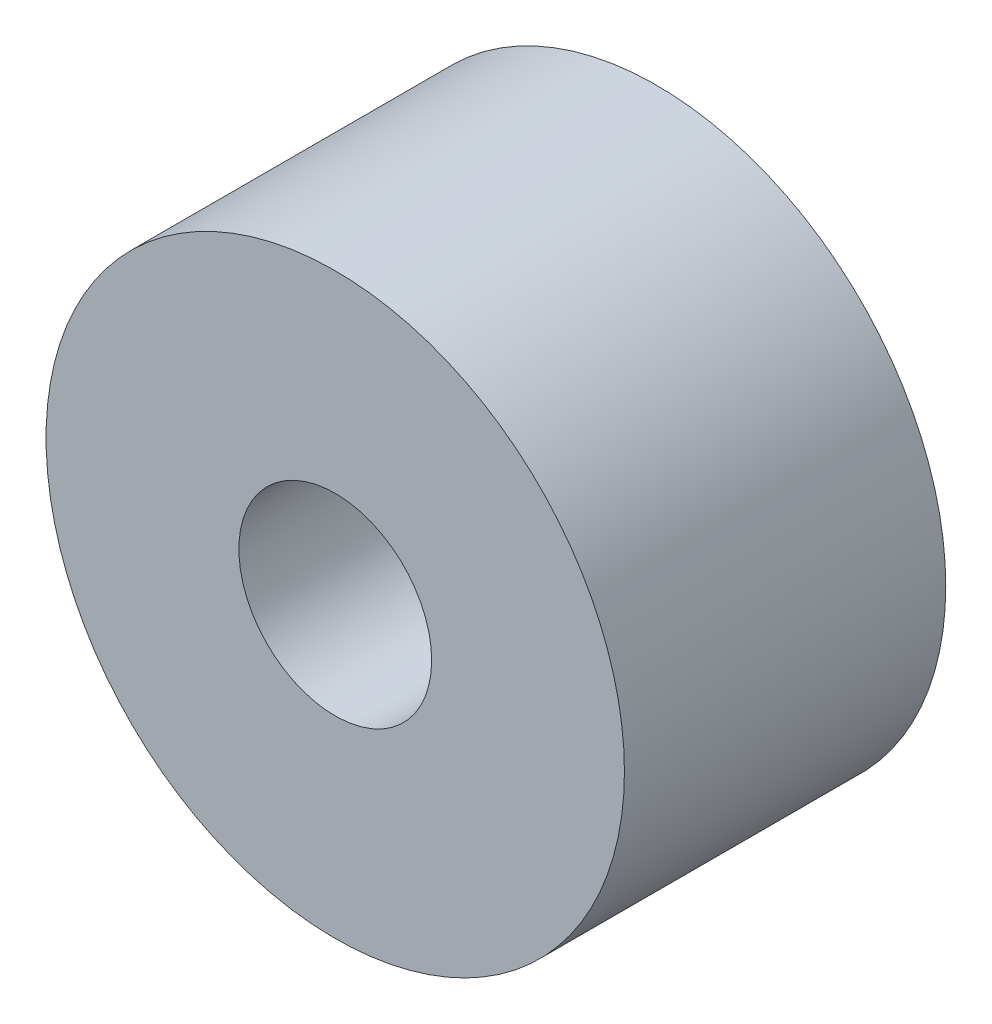
ISO-10303-21;
HEADER;
FILE_DESCRIPTION(('STEP AP214'),'2;1');
FILE_NAME('part.step','',(''),(''),'','','');
FILE_SCHEMA(('AUTOMOTIVE_DESIGN { 1 0 10303 214 1 1 1 1 }'));
ENDSEC;
DATA;
#1=APPLICATION_CONTEXT('core data for automotive mechanical design processes');
#2=APPLICATION_PROTOCOL_DEFINITION('international standard','automotive_design',2000,#1);
#3=PRODUCT_CONTEXT('',#1,'mechanical');
#4=PRODUCT('Part','Part','',(#3));
#5=PRODUCT_RELATED_PRODUCT_CATEGORY('part','',(#4));
#6=PRODUCT_DEFINITION_FORMATION('','',#4);
#7=PRODUCT_DEFINITION_CONTEXT('part definition',#1,'design');
#8=PRODUCT_DEFINITION('design','',#6,#7);
#9=PRODUCT_DEFINITION_SHAPE('','',#8);
#10=(LENGTH_UNIT() NAMED_UNIT(*) SI_UNIT(.MILLI.,.METRE.));
#11=(NAMED_UNIT(*) PLANE_ANGLE_UNIT() SI_UNIT($,.RADIAN.));
#12=(NAMED_UNIT(*) SI_UNIT($,.STERADIAN.) SOLID_ANGLE_UNIT());
#13=UNCERTAINTY_MEASURE_WITH_UNIT(LENGTH_MEASURE(1.E-05),#10,'distance_accuracy_value','');
#14=(GEOMETRIC_REPRESENTATION_CONTEXT(3) GLOBAL_UNCERTAINTY_ASSIGNED_CONTEXT((#13)) GLOBAL_UNIT_ASSIGNED_CONTEXT((#10,
#11,#12)) REPRESENTATION_CONTEXT('',''));
#15=CARTESIAN_POINT('',(0.,0.,0.));
#16=DIRECTION('',(0.,0.,1.));
#17=DIRECTION('',(1.,0.,0.));
#18=AXIS2_PLACEMENT_3D('',#15,#16,#17);
#19=CARTESIAN_POINT('',(0.,0.,5.));
#20=DIRECTION('',(0.,0.,1.));
#21=DIRECTION('',(1.,0.,0.));
#22=AXIS2_PLACEMENT_3D('',#19,#20,#21);
#23=PLANE('',#22);
#24=CARTESIAN_POINT('',(0.,0.,5.));
#25=DIRECTION('',(0.,0.,1.));
#26=DIRECTION('',(1.,0.,0.));
#27=AXIS2_PLACEMENT_3D('',#24,#25,#26);
#28=CIRCLE('',#27,4.5);
#29=CARTESIAN_POINT('',(4.5,0.,5.));
#30=VERTEX_POINT('',#29);
#31=EDGE_CURVE('E10',#30,#30,#28,.T.);
#32=ORIENTED_EDGE('',*,*,#31,.T.);
#33=EDGE_LOOP('',(#32));
#34=FACE_BOUND('',#33,.T.);
#35=CARTESIAN_POINT('',(0.,0.,5.));
#36=DIRECTION('',(0.,0.,1.));
#37=DIRECTION('',(1.,0.,0.));
#38=AXIS2_PLACEMENT_3D('',#35,#36,#37);
#39=CIRCLE('',#38,1.5);
#40=CARTESIAN_POINT('',(1.5,0.,5.));
#41=VERTEX_POINT('',#40);
#42=EDGE_CURVE('E48',#41,#41,#39,.T.);
#43=ORIENTED_EDGE('',*,*,#42,.F.);
#44=EDGE_LOOP('',(#43));
#45=FACE_BOUND('',#44,.T.);
#46=ADVANCED_FACE('F37',(#34,#45),#23,.T.);
#47=CARTESIAN_POINT('',(0.,0.,0.));
#48=DIRECTION('',(0.,0.,1.));
#49=DIRECTION('',(1.,0.,0.));
#50=AXIS2_PLACEMENT_3D('',#47,#48,#49);
#51=PLANE('',#50);
#52=CARTESIAN_POINT('',(0.,0.,0.));
#53=DIRECTION('',(0.,0.,1.));
#54=DIRECTION('',(1.,0.,0.));
#55=AXIS2_PLACEMENT_3D('',#52,#53,#54);
#56=CIRCLE('',#55,4.5);
#57=CARTESIAN_POINT('',(4.5,0.,0.));
#58=VERTEX_POINT('',#57);
#59=EDGE_CURVE('E41',#58,#58,#56,.T.);
#60=ORIENTED_EDGE('',*,*,#59,.F.);
#61=EDGE_LOOP('',(#60));
#62=FACE_BOUND('',#61,.T.);
#63=CARTESIAN_POINT('',(0.,0.,0.));
#64=DIRECTION('',(0.,0.,1.));
#65=DIRECTION('',(1.,0.,0.));
#66=AXIS2_PLACEMENT_3D('',#63,#64,#65);
#67=CIRCLE('',#66,1.5);
#68=CARTESIAN_POINT('',(1.5,0.,0.));
#69=VERTEX_POINT('',#68);
#70=EDGE_CURVE('E50',#69,#69,#67,.T.);
#71=ORIENTED_EDGE('',*,*,#70,.T.);
#72=EDGE_LOOP('',(#71));
#73=FACE_BOUND('',#72,.T.);
#74=ADVANCED_FACE('F60',(#62,#73),#51,.F.);
#75=CARTESIAN_POINT('',(0.,0.,5.));
#76=DIRECTION('',(0.,0.,-1.));
#77=DIRECTION('',(-1.,0.,0.));
#78=AXIS2_PLACEMENT_3D('',#75,#76,#77);
#79=CYLINDRICAL_SURFACE('',#78,4.5);
#80=ORIENTED_EDGE('',*,*,#31,.F.);
#81=EDGE_LOOP('',(#80));
#82=FACE_BOUND('',#81,.T.);
#83=ORIENTED_EDGE('',*,*,#59,.T.);
#84=EDGE_LOOP('',(#83));
#85=FACE_BOUND('',#84,.T.);
#86=ADVANCED_FACE('F39',(#82,#85),#79,.T.);
#87=CARTESIAN_POINT('',(0.,0.,5.));
#88=DIRECTION('',(0.,0.,-1.));
#89=DIRECTION('',(-1.,0.,0.));
#90=AXIS2_PLACEMENT_3D('',#87,#88,#89);
#91=CYLINDRICAL_SURFACE('',#90,1.5);
#92=ORIENTED_EDGE('',*,*,#42,.T.);
#93=EDGE_LOOP('',(#92));
#94=FACE_BOUND('',#93,.T.);
#95=ORIENTED_EDGE('',*,*,#70,.F.);
#96=EDGE_LOOP('',(#95));
#97=FACE_BOUND('',#96,.T.);
#98=ADVANCED_FACE('F56',(#94,#97),#91,.F.);
#99=CLOSED_SHELL('',(#46,#74,#86,#98));
#100=MANIFOLD_SOLID_BREP('B2',#99);
#101=ADVANCED_BREP_SHAPE_REPRESENTATION('',(#18,#100),#14);
#102=SHAPE_DEFINITION_REPRESENTATION(#9,#101);
ENDSEC;
END-ISO-10303-21;
